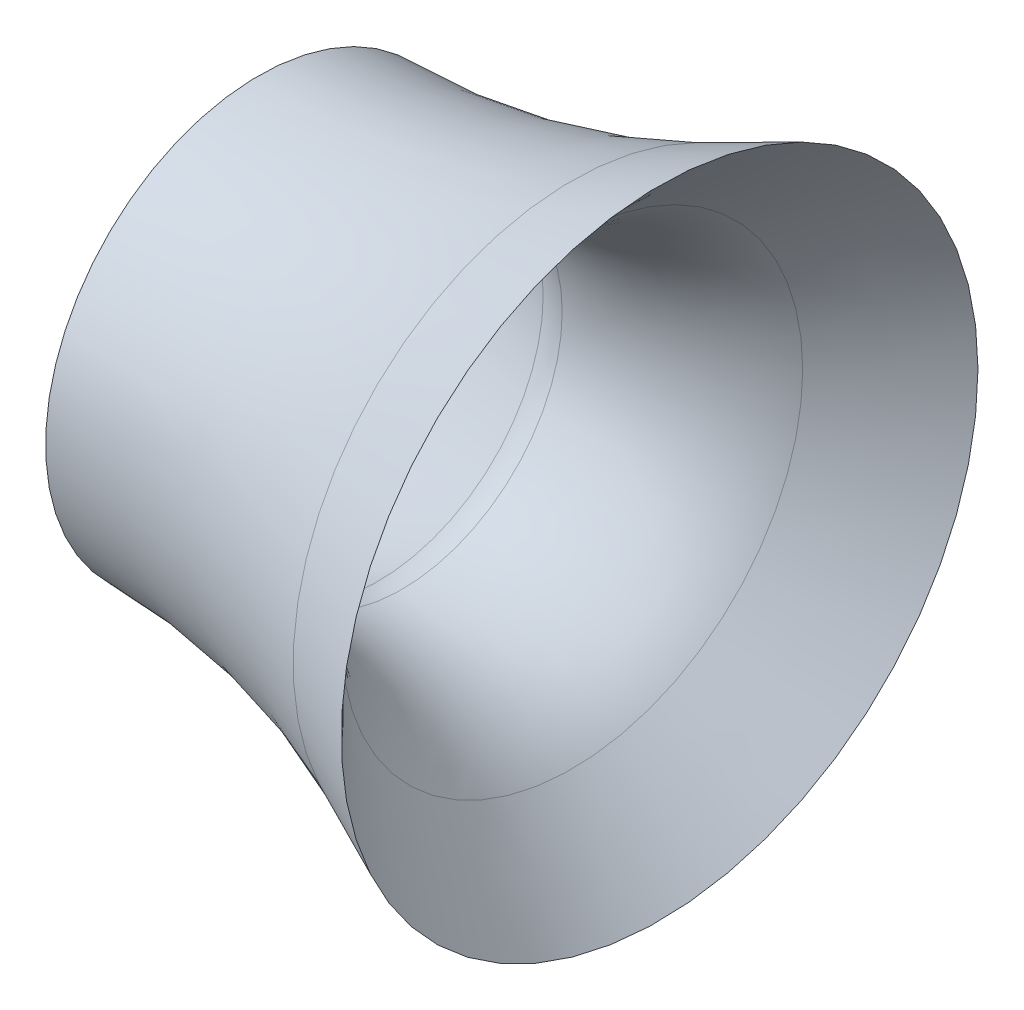
ISO-10303-21;
HEADER;
FILE_DESCRIPTION(('STEP AP214'),'2;1');
FILE_NAME('part.step','',(''),(''),'','','');
FILE_SCHEMA(('AUTOMOTIVE_DESIGN { 1 0 10303 214 1 1 1 1 }'));
ENDSEC;
DATA;
#1=APPLICATION_CONTEXT('core data for automotive mechanical design processes');
#2=APPLICATION_PROTOCOL_DEFINITION('international standard','automotive_design',2000,#1);
#3=PRODUCT_CONTEXT('',#1,'mechanical');
#4=PRODUCT('Part','Part','',(#3));
#5=PRODUCT_RELATED_PRODUCT_CATEGORY('part','',(#4));
#6=PRODUCT_DEFINITION_FORMATION('','',#4);
#7=PRODUCT_DEFINITION_CONTEXT('part definition',#1,'design');
#8=PRODUCT_DEFINITION('design','',#6,#7);
#9=PRODUCT_DEFINITION_SHAPE('','',#8);
#10=(LENGTH_UNIT() NAMED_UNIT(*) SI_UNIT(.MILLI.,.METRE.));
#11=(NAMED_UNIT(*) PLANE_ANGLE_UNIT() SI_UNIT($,.RADIAN.));
#12=(NAMED_UNIT(*) SI_UNIT($,.STERADIAN.) SOLID_ANGLE_UNIT());
#13=UNCERTAINTY_MEASURE_WITH_UNIT(LENGTH_MEASURE(1.E-05),#10,'distance_accuracy_value','');
#14=(GEOMETRIC_REPRESENTATION_CONTEXT(3) GLOBAL_UNCERTAINTY_ASSIGNED_CONTEXT((#13)) GLOBAL_UNIT_ASSIGNED_CONTEXT((#10,
#11,#12)) REPRESENTATION_CONTEXT('',''));
#15=CARTESIAN_POINT('',(0.,0.,0.));
#16=DIRECTION('',(0.,0.,1.));
#17=DIRECTION('',(1.,0.,0.));
#18=AXIS2_PLACEMENT_3D('',#15,#16,#17);
#19=CARTESIAN_POINT('',(0.,11.5361374682942,0.));
#20=CARTESIAN_POINT('',(-19.9482573544596,19.9475956971547,0.));
#21=CARTESIAN_POINT('',(-40.1270102829806,24.64,0.));
#22=B_SPLINE_CURVE_WITH_KNOTS('',2,(#19,#20,#21),.UNSPECIFIED.,.F.,.F.,(3,3),(0.,1.),.UNSPECIFIED.);
#23=CARTESIAN_POINT('',(0.,0.,0.));
#24=DIRECTION('',(1.,0.,0.));
#25=AXIS1_PLACEMENT('',#23,#24);
#26=SURFACE_OF_REVOLUTION('',#22,#25);
#27=CARTESIAN_POINT('',(-8.33769055494808,0.,0.));
#28=DIRECTION('',(1.,0.,0.));
#29=DIRECTION('',(0.,0.,-1.));
#30=AXIS2_PLACEMENT_3D('',#27,#28,#29);
#31=CIRCLE('',#30,14.8855709050366);
#32=CARTESIAN_POINT('',(-8.33769055494808,0.,-14.8855709050366));
#33=VERTEX_POINT('',#32);
#34=EDGE_CURVE('E73',#33,#33,#31,.T.);
#35=ORIENTED_EDGE('',*,*,#34,.F.);
#36=EDGE_LOOP('',(#35));
#37=FACE_BOUND('',#36,.T.);
#38=CARTESIAN_POINT('',(0.,0.,0.));
#39=DIRECTION('',(1.,0.,0.));
#40=DIRECTION('',(0.,0.,-1.));
#41=AXIS2_PLACEMENT_3D('',#38,#39,#40);
#42=CIRCLE('',#41,11.5361374682942);
#43=CARTESIAN_POINT('',(0.,0.,-11.5361374682942));
#44=VERTEX_POINT('',#43);
#45=EDGE_CURVE('E10',#44,#44,#42,.T.);
#46=ORIENTED_EDGE('',*,*,#45,.T.);
#47=EDGE_LOOP('',(#46));
#48=FACE_BOUND('',#47,.T.);
#49=ADVANCED_FACE('F45',(#37,#48),#26,.T.);
#50=CARTESIAN_POINT('',(1.66230944505193,0.,0.));
#51=DIRECTION('',(1.,0.,0.));
#52=DIRECTION('',(0.,0.,-1.));
#53=AXIS2_PLACEMENT_3D('',#50,#51,#52);
#54=TOROIDAL_SURFACE('',#53,15.4784,4.2784);
#55=ORIENTED_EDGE('',*,*,#45,.F.);
#56=EDGE_LOOP('',(#55));
#57=FACE_BOUND('',#56,.T.);
#58=CARTESIAN_POINT('',(1.66230944505193,0.,0.));
#59=DIRECTION('',(1.,0.,0.));
#60=DIRECTION('',(0.,0.,-1.));
#61=AXIS2_PLACEMENT_3D('',#58,#59,#60);
#62=CIRCLE('',#61,11.2);
#63=CARTESIAN_POINT('',(1.66230944505193,0.,-11.2));
#64=VERTEX_POINT('',#63);
#65=EDGE_CURVE('E53',#64,#64,#62,.T.);
#66=ORIENTED_EDGE('',*,*,#65,.T.);
#67=EDGE_LOOP('',(#66));
#68=FACE_BOUND('',#67,.T.);
#69=ADVANCED_FACE('F87',(#57,#68),#54,.T.);
#70=CARTESIAN_POINT('',(1.66230944505193,0.,0.));
#71=DIRECTION('',(1.,0.,0.));
#72=DIRECTION('',(0.,0.,-1.));
#73=AXIS2_PLACEMENT_3D('',#70,#71,#72);
#74=TOROIDAL_SURFACE('',#73,28.,16.8);
#75=ORIENTED_EDGE('',*,*,#65,.F.);
#76=EDGE_LOOP('',(#75));
#77=FACE_BOUND('',#76,.T.);
#78=CARTESIAN_POINT('',(13.5417033689859,0.,0.));
#79=DIRECTION('',(1.,0.,0.));
#80=DIRECTION('',(0.,0.,-1.));
#81=AXIS2_PLACEMENT_3D('',#78,#79,#80);
#82=CIRCLE('',#81,16.120606076066);
#83=CARTESIAN_POINT('',(13.5417033689859,0.,-16.120606076066));
#84=VERTEX_POINT('',#83);
#85=EDGE_CURVE('E58',#84,#84,#82,.T.);
#86=ORIENTED_EDGE('',*,*,#85,.T.);
#87=EDGE_LOOP('',(#86));
#88=FACE_BOUND('',#87,.T.);
#89=ADVANCED_FACE('F91',(#77,#88),#74,.T.);
#90=CARTESIAN_POINT('',(19.6623094450522,0.,0.));
#91=DIRECTION('',(1.,0.,0.));
#92=DIRECTION('',(0.,0.,-1.));
#93=AXIS2_PLACEMENT_3D('',#90,#91,#92);
#94=CONICAL_SURFACE('',#93,22.2412121521322,0.785398163397447);
#95=ORIENTED_EDGE('',*,*,#85,.F.);
#96=EDGE_LOOP('',(#95));
#97=FACE_BOUND('',#96,.T.);
#98=CARTESIAN_POINT('',(19.6623094450522,0.,0.));
#99=DIRECTION('',(1.,0.,0.));
#100=DIRECTION('',(0.,0.,-1.));
#101=AXIS2_PLACEMENT_3D('',#98,#99,#100);
#102=CIRCLE('',#101,22.2412121521322);
#103=CARTESIAN_POINT('',(19.6623094450522,0.,-22.2412121521322));
#104=VERTEX_POINT('',#103);
#105=EDGE_CURVE('E63',#104,#104,#102,.T.);
#106=ORIENTED_EDGE('',*,*,#105,.T.);
#107=EDGE_LOOP('',(#106));
#108=FACE_BOUND('',#107,.T.);
#109=ADVANCED_FACE('F96',(#97,#108),#94,.F.);
#110=CARTESIAN_POINT('',(-103.62375157043,0.,0.));
#111=DIRECTION('',(1.,0.,0.));
#112=DIRECTION('',(0.,0.,-1.));
#113=AXIS2_PLACEMENT_3D('',#110,#111,#112);
#114=DEGENERATE_TOROIDAL_SURFACE('',#113,286.62902320219,291.719672755462,.T.);
#115=CARTESIAN_POINT('',(13.5417033689859,0.,0.));
#116=DIRECTION('',(1.,0.,0.));
#117=DIRECTION('',(0.,0.,-1.));
#118=AXIS2_PLACEMENT_3D('',#115,#116,#117);
#119=CIRCLE('',#118,19.4724705193221);
#120=CARTESIAN_POINT('',(13.5417033689859,0.,-19.4724705193221));
#121=VERTEX_POINT('',#120);
#122=EDGE_CURVE('E69',#121,#121,#119,.T.);
#123=ORIENTED_EDGE('',*,*,#122,.T.);
#124=EDGE_LOOP('',(#123));
#125=FACE_BOUND('',#124,.T.);
#126=ORIENTED_EDGE('',*,*,#105,.F.);
#127=EDGE_LOOP('',(#126));
#128=FACE_BOUND('',#127,.T.);
#129=ADVANCED_FACE('F102',(#125,#128),#114,.F.);
#130=CARTESIAN_POINT('',(-8.33769055494807,0.,0.));
#131=DIRECTION('',(1.,0.,0.));
#132=DIRECTION('',(0.,0.,-1.));
#133=AXIS2_PLACEMENT_3D('',#130,#131,#132);
#134=TOROIDAL_SURFACE('',#133,69.3610956139046,54.4755247088679);
#135=ORIENTED_EDGE('',*,*,#122,.F.);
#136=EDGE_LOOP('',(#135));
#137=FACE_BOUND('',#136,.T.);
#138=ORIENTED_EDGE('',*,*,#34,.T.);
#139=EDGE_LOOP('',(#138));
#140=FACE_BOUND('',#139,.T.);
#141=ADVANCED_FACE('F84',(#137,#140),#134,.F.);
#142=CLOSED_SHELL('',(#49,#69,#89,#109,#129,#141));
#143=MANIFOLD_SOLID_BREP('B2',#142);
#144=ADVANCED_BREP_SHAPE_REPRESENTATION('',(#18,#143),#14);
#145=SHAPE_DEFINITION_REPRESENTATION(#9,#144);
ENDSEC;
END-ISO-10303-21;
